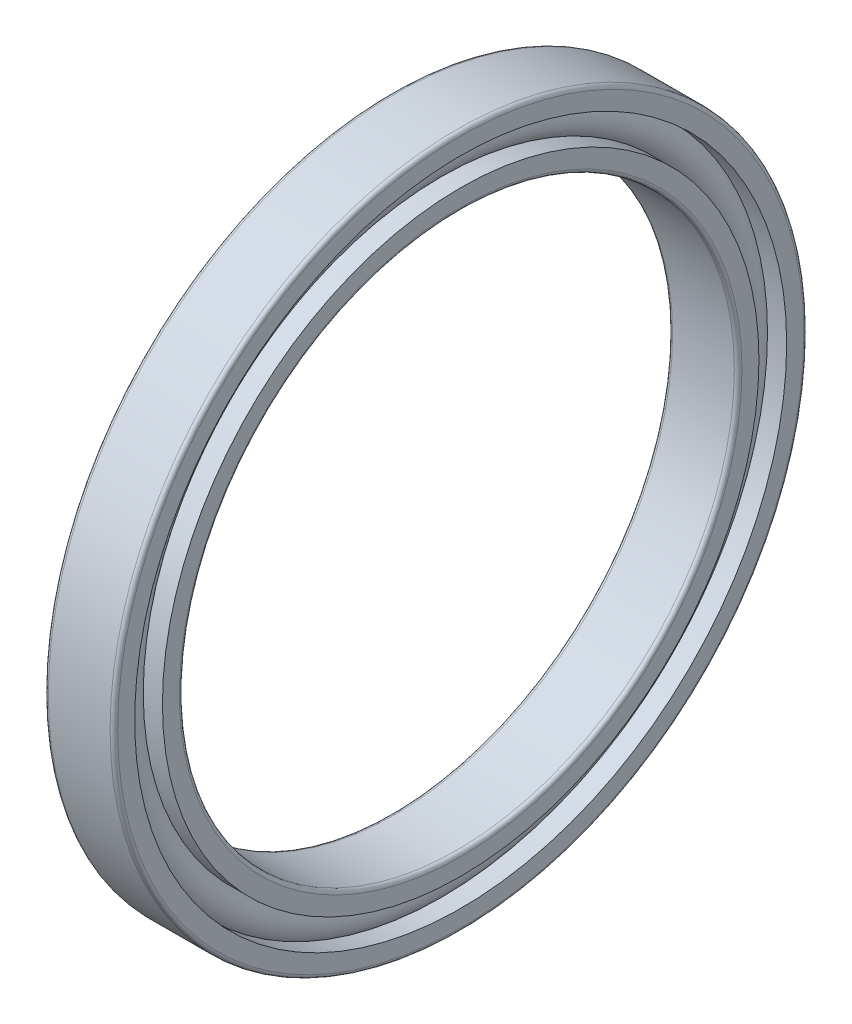
ISO-10303-21;
HEADER;
FILE_DESCRIPTION(('STEP AP214'),'2;1');
FILE_NAME('part.step','',(''),(''),'','','');
FILE_SCHEMA(('AUTOMOTIVE_DESIGN { 1 0 10303 214 1 1 1 1 }'));
ENDSEC;
DATA;
#1=APPLICATION_CONTEXT('core data for automotive mechanical design processes');
#2=APPLICATION_PROTOCOL_DEFINITION('international standard','automotive_design',2000,#1);
#3=PRODUCT_CONTEXT('',#1,'mechanical');
#4=PRODUCT('Part','Part','',(#3));
#5=PRODUCT_RELATED_PRODUCT_CATEGORY('part','',(#4));
#6=PRODUCT_DEFINITION_FORMATION('','',#4);
#7=PRODUCT_DEFINITION_CONTEXT('part definition',#1,'design');
#8=PRODUCT_DEFINITION('design','',#6,#7);
#9=PRODUCT_DEFINITION_SHAPE('','',#8);
#10=(LENGTH_UNIT() NAMED_UNIT(*) SI_UNIT(.MILLI.,.METRE.));
#11=(NAMED_UNIT(*) PLANE_ANGLE_UNIT() SI_UNIT($,.RADIAN.));
#12=(NAMED_UNIT(*) SI_UNIT($,.STERADIAN.) SOLID_ANGLE_UNIT());
#13=UNCERTAINTY_MEASURE_WITH_UNIT(LENGTH_MEASURE(1.E-05),#10,'distance_accuracy_value','');
#14=(GEOMETRIC_REPRESENTATION_CONTEXT(3) GLOBAL_UNCERTAINTY_ASSIGNED_CONTEXT((#13)) GLOBAL_UNIT_ASSIGNED_CONTEXT((#10,
#11,#12)) REPRESENTATION_CONTEXT('',''));
#15=CARTESIAN_POINT('',(0.,0.,0.));
#16=DIRECTION('',(0.,0.,1.));
#17=DIRECTION('',(1.,0.,0.));
#18=AXIS2_PLACEMENT_3D('',#15,#16,#17);
#19=CARTESIAN_POINT('',(0.,0.,0.));
#20=DIRECTION('',(-1.,0.,0.));
#21=DIRECTION('',(0.,0.,1.));
#22=AXIS2_PLACEMENT_3D('',#19,#20,#21);
#23=TOROIDAL_SURFACE('',#22,90.,6.);
#24=CARTESIAN_POINT('',(4.47213595499958,0.,0.));
#25=DIRECTION('',(-1.,0.,0.));
#26=DIRECTION('',(0.,0.,1.));
#27=AXIS2_PLACEMENT_3D('',#24,#25,#26);
#28=CIRCLE('',#27,94.);
#29=CARTESIAN_POINT('',(4.47213595499958,0.,94.));
#30=VERTEX_POINT('',#29);
#31=EDGE_CURVE('E45',#30,#30,#28,.F.);
#32=ORIENTED_EDGE('',*,*,#31,.T.);
#33=EDGE_LOOP('',(#32));
#34=FACE_BOUND('',#33,.T.);
#35=CARTESIAN_POINT('',(4.47213595499958,0.,0.));
#36=DIRECTION('',(-1.,0.,0.));
#37=DIRECTION('',(0.,0.,1.));
#38=AXIS2_PLACEMENT_3D('',#35,#36,#37);
#39=CIRCLE('',#38,86.);
#40=CARTESIAN_POINT('',(4.47213595499958,0.,86.));
#41=VERTEX_POINT('',#40);
#42=EDGE_CURVE('E10',#41,#41,#39,.T.);
#43=ORIENTED_EDGE('',*,*,#42,.T.);
#44=EDGE_LOOP('',(#43));
#45=FACE_BOUND('',#44,.T.);
#46=ADVANCED_FACE('F41',(#34,#45),#23,.T.);
#47=CARTESIAN_POINT('',(-20.6375,0.,0.));
#48=DIRECTION('',(1.,0.,0.));
#49=DIRECTION('',(0.,0.,-1.));
#50=AXIS2_PLACEMENT_3D('',#47,#48,#49);
#51=CYLINDRICAL_SURFACE('',#50,86.);
#52=CARTESIAN_POINT('',(10.,0.,0.));
#53=DIRECTION('',(1.,0.,0.));
#54=DIRECTION('',(0.,0.,-1.));
#55=AXIS2_PLACEMENT_3D('',#52,#53,#54);
#56=CIRCLE('',#55,86.);
#57=CARTESIAN_POINT('',(10.,0.,-86.));
#58=VERTEX_POINT('',#57);
#59=EDGE_CURVE('E56',#58,#58,#56,.T.);
#60=ORIENTED_EDGE('',*,*,#59,.F.);
#61=EDGE_LOOP('',(#60));
#62=FACE_BOUND('',#61,.T.);
#63=ORIENTED_EDGE('',*,*,#42,.F.);
#64=EDGE_LOOP('',(#63));
#65=FACE_BOUND('',#64,.T.);
#66=ADVANCED_FACE('F105',(#62,#65),#51,.T.);
#67=CARTESIAN_POINT('',(-20.6375,0.,0.));
#68=DIRECTION('',(1.,0.,0.));
#69=DIRECTION('',(0.,0.,-1.));
#70=AXIS2_PLACEMENT_3D('',#67,#68,#69);
#71=CYLINDRICAL_SURFACE('',#70,86.);
#72=CARTESIAN_POINT('',(-10.,0.,0.));
#73=DIRECTION('',(1.,0.,0.));
#74=DIRECTION('',(0.,0.,-1.));
#75=AXIS2_PLACEMENT_3D('',#72,#73,#74);
#76=CIRCLE('',#75,86.);
#77=CARTESIAN_POINT('',(-10.,0.,-86.));
#78=VERTEX_POINT('',#77);
#79=EDGE_CURVE('E68',#78,#78,#76,.T.);
#80=ORIENTED_EDGE('',*,*,#79,.T.);
#81=EDGE_LOOP('',(#80));
#82=FACE_BOUND('',#81,.T.);
#83=CARTESIAN_POINT('',(-4.47213595499958,0.,0.));
#84=DIRECTION('',(1.,0.,0.));
#85=DIRECTION('',(0.,0.,-1.));
#86=AXIS2_PLACEMENT_3D('',#83,#84,#85);
#87=CIRCLE('',#86,86.);
#88=CARTESIAN_POINT('',(-4.47213595499958,0.,-86.));
#89=VERTEX_POINT('',#88);
#90=EDGE_CURVE('E50',#89,#89,#87,.T.);
#91=ORIENTED_EDGE('',*,*,#90,.F.);
#92=EDGE_LOOP('',(#91));
#93=FACE_BOUND('',#92,.T.);
#94=ADVANCED_FACE('F108',(#82,#93),#71,.T.);
#95=CARTESIAN_POINT('',(10.,81.1,0.));
#96=DIRECTION('',(1.,0.,0.));
#97=DIRECTION('',(0.,0.,-1.));
#98=AXIS2_PLACEMENT_3D('',#95,#96,#97);
#99=PLANE('',#98);
#100=ORIENTED_EDGE('',*,*,#59,.T.);
#101=EDGE_LOOP('',(#100));
#102=FACE_BOUND('',#101,.T.);
#103=CARTESIAN_POINT('',(10.,0.,0.));
#104=DIRECTION('',(1.,0.,0.));
#105=DIRECTION('',(0.,0.,-1.));
#106=AXIS2_PLACEMENT_3D('',#103,#104,#105);
#107=CIRCLE('',#106,81.1);
#108=CARTESIAN_POINT('',(10.,0.,-81.1));
#109=VERTEX_POINT('',#108);
#110=EDGE_CURVE('E95',#109,#109,#107,.T.);
#111=ORIENTED_EDGE('',*,*,#110,.F.);
#112=EDGE_LOOP('',(#111));
#113=FACE_BOUND('',#112,.T.);
#114=ADVANCED_FACE('F102',(#102,#113),#99,.T.);
#115=CARTESIAN_POINT('',(8.9,0.,0.));
#116=DIRECTION('',(1.,0.,0.));
#117=DIRECTION('',(0.,0.,-1.));
#118=AXIS2_PLACEMENT_3D('',#115,#116,#117);
#119=TOROIDAL_SURFACE('',#118,81.1,1.1);
#120=ORIENTED_EDGE('',*,*,#110,.T.);
#121=EDGE_LOOP('',(#120));
#122=FACE_BOUND('',#121,.T.);
#123=CARTESIAN_POINT('',(8.9,0.,0.));
#124=DIRECTION('',(1.,0.,0.));
#125=DIRECTION('',(0.,0.,-1.));
#126=AXIS2_PLACEMENT_3D('',#123,#124,#125);
#127=CIRCLE('',#126,80.);
#128=CARTESIAN_POINT('',(8.9,0.,-80.));
#129=VERTEX_POINT('',#128);
#130=EDGE_CURVE('E91',#129,#129,#127,.T.);
#131=ORIENTED_EDGE('',*,*,#130,.F.);
#132=EDGE_LOOP('',(#131));
#133=FACE_BOUND('',#132,.T.);
#134=ADVANCED_FACE('F119',(#122,#133),#119,.T.);
#135=CARTESIAN_POINT('',(-20.6375,0.,0.));
#136=DIRECTION('',(1.,0.,0.));
#137=DIRECTION('',(0.,0.,-1.));
#138=AXIS2_PLACEMENT_3D('',#135,#136,#137);
#139=CYLINDRICAL_SURFACE('',#138,80.);
#140=ORIENTED_EDGE('',*,*,#130,.T.);
#141=EDGE_LOOP('',(#140));
#142=FACE_BOUND('',#141,.T.);
#143=CARTESIAN_POINT('',(-8.9,0.,0.));
#144=DIRECTION('',(1.,0.,0.));
#145=DIRECTION('',(0.,0.,-1.));
#146=AXIS2_PLACEMENT_3D('',#143,#144,#145);
#147=CIRCLE('',#146,80.);
#148=CARTESIAN_POINT('',(-8.9,0.,-80.));
#149=VERTEX_POINT('',#148);
#150=EDGE_CURVE('E87',#149,#149,#147,.T.);
#151=ORIENTED_EDGE('',*,*,#150,.F.);
#152=EDGE_LOOP('',(#151));
#153=FACE_BOUND('',#152,.T.);
#154=ADVANCED_FACE('F122',(#142,#153),#139,.F.);
#155=CARTESIAN_POINT('',(-8.9,0.,0.));
#156=DIRECTION('',(1.,0.,0.));
#157=DIRECTION('',(0.,0.,-1.));
#158=AXIS2_PLACEMENT_3D('',#155,#156,#157);
#159=TOROIDAL_SURFACE('',#158,81.1,1.1);
#160=ORIENTED_EDGE('',*,*,#150,.T.);
#161=EDGE_LOOP('',(#160));
#162=FACE_BOUND('',#161,.T.);
#163=CARTESIAN_POINT('',(-10.,0.,0.));
#164=DIRECTION('',(1.,0.,0.));
#165=DIRECTION('',(0.,0.,-1.));
#166=AXIS2_PLACEMENT_3D('',#163,#164,#165);
#167=CIRCLE('',#166,81.1);
#168=CARTESIAN_POINT('',(-10.,0.,-81.1));
#169=VERTEX_POINT('',#168);
#170=EDGE_CURVE('E83',#169,#169,#167,.T.);
#171=ORIENTED_EDGE('',*,*,#170,.F.);
#172=EDGE_LOOP('',(#171));
#173=FACE_BOUND('',#172,.T.);
#174=ADVANCED_FACE('F126',(#162,#173),#159,.T.);
#175=CARTESIAN_POINT('',(-10.,86.,0.));
#176=DIRECTION('',(-1.,0.,0.));
#177=DIRECTION('',(0.,0.,1.));
#178=AXIS2_PLACEMENT_3D('',#175,#176,#177);
#179=PLANE('',#178);
#180=ORIENTED_EDGE('',*,*,#170,.T.);
#181=EDGE_LOOP('',(#180));
#182=FACE_BOUND('',#181,.T.);
#183=ORIENTED_EDGE('',*,*,#79,.F.);
#184=EDGE_LOOP('',(#183));
#185=FACE_BOUND('',#184,.T.);
#186=ADVANCED_FACE('F130',(#182,#185),#179,.T.);
#187=CARTESIAN_POINT('',(-4.47213595499958,0.,0.));
#188=DIRECTION('',(1.,0.,0.));
#189=DIRECTION('',(0.,0.,-1.));
#190=AXIS2_PLACEMENT_3D('',#187,#188,#189);
#191=CIRCLE('',#190,94.);
#192=CARTESIAN_POINT('',(-4.47213595499958,0.,-94.));
#193=VERTEX_POINT('',#192);
#194=EDGE_CURVE('E59',#193,#193,#191,.F.);
#195=ORIENTED_EDGE('',*,*,#194,.T.);
#196=EDGE_LOOP('',(#195));
#197=FACE_BOUND('',#196,.T.);
#198=ORIENTED_EDGE('',*,*,#90,.T.);
#199=EDGE_LOOP('',(#198));
#200=FACE_BOUND('',#199,.T.);
#201=ADVANCED_FACE('F43',(#197,#200),#23,.T.);
#202=CARTESIAN_POINT('',(-20.6375,0.,0.));
#203=DIRECTION('',(1.,0.,0.));
#204=DIRECTION('',(0.,0.,-1.));
#205=AXIS2_PLACEMENT_3D('',#202,#203,#204);
#206=CYLINDRICAL_SURFACE('',#205,94.);
#207=CARTESIAN_POINT('',(9.99999999999999,0.,0.));
#208=DIRECTION('',(1.,0.,0.));
#209=DIRECTION('',(0.,0.,-1.));
#210=AXIS2_PLACEMENT_3D('',#207,#208,#209);
#211=CIRCLE('',#210,94.);
#212=CARTESIAN_POINT('',(9.99999999999999,0.,-94.));
#213=VERTEX_POINT('',#212);
#214=EDGE_CURVE('E62',#213,#213,#211,.T.);
#215=ORIENTED_EDGE('',*,*,#214,.T.);
#216=EDGE_LOOP('',(#215));
#217=FACE_BOUND('',#216,.T.);
#218=ORIENTED_EDGE('',*,*,#31,.F.);
#219=EDGE_LOOP('',(#218));
#220=FACE_BOUND('',#219,.T.);
#221=ADVANCED_FACE('F135',(#217,#220),#206,.F.);
#222=CARTESIAN_POINT('',(-20.6375,0.,0.));
#223=DIRECTION('',(1.,0.,0.));
#224=DIRECTION('',(0.,0.,-1.));
#225=AXIS2_PLACEMENT_3D('',#222,#223,#224);
#226=CYLINDRICAL_SURFACE('',#225,94.);
#227=CARTESIAN_POINT('',(-9.99999999999999,0.,0.));
#228=DIRECTION('',(1.,0.,0.));
#229=DIRECTION('',(0.,0.,-1.));
#230=AXIS2_PLACEMENT_3D('',#227,#228,#229);
#231=CIRCLE('',#230,94.);
#232=CARTESIAN_POINT('',(-9.99999999999999,0.,-94.));
#233=VERTEX_POINT('',#232);
#234=EDGE_CURVE('E166',#233,#233,#231,.T.);
#235=ORIENTED_EDGE('',*,*,#234,.F.);
#236=EDGE_LOOP('',(#235));
#237=FACE_BOUND('',#236,.T.);
#238=ORIENTED_EDGE('',*,*,#194,.F.);
#239=EDGE_LOOP('',(#238));
#240=FACE_BOUND('',#239,.T.);
#241=ADVANCED_FACE('F138',(#237,#240),#226,.F.);
#242=CARTESIAN_POINT('',(9.99999999999999,98.9,0.));
#243=DIRECTION('',(1.,0.,0.));
#244=DIRECTION('',(0.,0.,-1.));
#245=AXIS2_PLACEMENT_3D('',#242,#243,#244);
#246=PLANE('',#245);
#247=CARTESIAN_POINT('',(9.99999999999999,0.,0.));
#248=DIRECTION('',(1.,0.,0.));
#249=DIRECTION('',(0.,0.,-1.));
#250=AXIS2_PLACEMENT_3D('',#247,#248,#249);
#251=CIRCLE('',#250,98.9);
#252=CARTESIAN_POINT('',(9.99999999999999,0.,-98.9));
#253=VERTEX_POINT('',#252);
#254=EDGE_CURVE('E70',#253,#253,#251,.T.);
#255=ORIENTED_EDGE('',*,*,#254,.T.);
#256=EDGE_LOOP('',(#255));
#257=FACE_BOUND('',#256,.T.);
#258=ORIENTED_EDGE('',*,*,#214,.F.);
#259=EDGE_LOOP('',(#258));
#260=FACE_BOUND('',#259,.T.);
#261=ADVANCED_FACE('F139',(#257,#260),#246,.T.);
#262=CARTESIAN_POINT('',(8.89999999999999,0.,0.));
#263=DIRECTION('',(1.,0.,0.));
#264=DIRECTION('',(0.,0.,-1.));
#265=AXIS2_PLACEMENT_3D('',#262,#263,#264);
#266=TOROIDAL_SURFACE('',#265,98.9,1.10000000000001);
#267=CARTESIAN_POINT('',(8.89999999999999,0.,0.));
#268=DIRECTION('',(1.,0.,0.));
#269=DIRECTION('',(0.,0.,-1.));
#270=AXIS2_PLACEMENT_3D('',#267,#268,#269);
#271=CIRCLE('',#270,100.);
#272=CARTESIAN_POINT('',(8.89999999999999,0.,-100.));
#273=VERTEX_POINT('',#272);
#274=EDGE_CURVE('E76',#273,#273,#271,.T.);
#275=ORIENTED_EDGE('',*,*,#274,.T.);
#276=EDGE_LOOP('',(#275));
#277=FACE_BOUND('',#276,.T.);
#278=ORIENTED_EDGE('',*,*,#254,.F.);
#279=EDGE_LOOP('',(#278));
#280=FACE_BOUND('',#279,.T.);
#281=ADVANCED_FACE('F142',(#277,#280),#266,.T.);
#282=CARTESIAN_POINT('',(-20.6375,0.,0.));
#283=DIRECTION('',(1.,0.,0.));
#284=DIRECTION('',(0.,0.,-1.));
#285=AXIS2_PLACEMENT_3D('',#282,#283,#284);
#286=CYLINDRICAL_SURFACE('',#285,100.);
#287=CARTESIAN_POINT('',(-8.89999999999999,0.,0.));
#288=DIRECTION('',(1.,0.,0.));
#289=DIRECTION('',(0.,0.,-1.));
#290=AXIS2_PLACEMENT_3D('',#287,#288,#289);
#291=CIRCLE('',#290,100.);
#292=CARTESIAN_POINT('',(-8.89999999999999,0.,-100.));
#293=VERTEX_POINT('',#292);
#294=EDGE_CURVE('E172',#293,#293,#291,.T.);
#295=ORIENTED_EDGE('',*,*,#294,.T.);
#296=EDGE_LOOP('',(#295));
#297=FACE_BOUND('',#296,.T.);
#298=ORIENTED_EDGE('',*,*,#274,.F.);
#299=EDGE_LOOP('',(#298));
#300=FACE_BOUND('',#299,.T.);
#301=ADVANCED_FACE('F146',(#297,#300),#286,.T.);
#302=CARTESIAN_POINT('',(-8.89999999999999,0.,0.));
#303=DIRECTION('',(1.,0.,0.));
#304=DIRECTION('',(0.,0.,-1.));
#305=AXIS2_PLACEMENT_3D('',#302,#303,#304);
#306=TOROIDAL_SURFACE('',#305,98.9,1.10000000000001);
#307=CARTESIAN_POINT('',(-9.99999999999999,0.,0.));
#308=DIRECTION('',(1.,0.,0.));
#309=DIRECTION('',(0.,0.,-1.));
#310=AXIS2_PLACEMENT_3D('',#307,#308,#309);
#311=CIRCLE('',#310,98.9);
#312=CARTESIAN_POINT('',(-9.99999999999999,0.,-98.9));
#313=VERTEX_POINT('',#312);
#314=EDGE_CURVE('E168',#313,#313,#311,.T.);
#315=ORIENTED_EDGE('',*,*,#314,.T.);
#316=EDGE_LOOP('',(#315));
#317=FACE_BOUND('',#316,.T.);
#318=ORIENTED_EDGE('',*,*,#294,.F.);
#319=EDGE_LOOP('',(#318));
#320=FACE_BOUND('',#319,.T.);
#321=ADVANCED_FACE('F150',(#317,#320),#306,.T.);
#322=CARTESIAN_POINT('',(-9.99999999999999,94.,0.));
#323=DIRECTION('',(-1.,0.,0.));
#324=DIRECTION('',(0.,0.,1.));
#325=AXIS2_PLACEMENT_3D('',#322,#323,#324);
#326=PLANE('',#325);
#327=ORIENTED_EDGE('',*,*,#234,.T.);
#328=EDGE_LOOP('',(#327));
#329=FACE_BOUND('',#328,.T.);
#330=ORIENTED_EDGE('',*,*,#314,.F.);
#331=EDGE_LOOP('',(#330));
#332=FACE_BOUND('',#331,.T.);
#333=ADVANCED_FACE('F154',(#329,#332),#326,.T.);
#334=CLOSED_SHELL('',(#46,#66,#94,#114,#134,#154,#174,#186,#201,#221,#241,#261,#281,#301,#321,#333));
#335=MANIFOLD_SOLID_BREP('B2',#334);
#336=ADVANCED_BREP_SHAPE_REPRESENTATION('',(#18,#335),#14);
#337=SHAPE_DEFINITION_REPRESENTATION(#9,#336);
ENDSEC;
END-ISO-10303-21;
